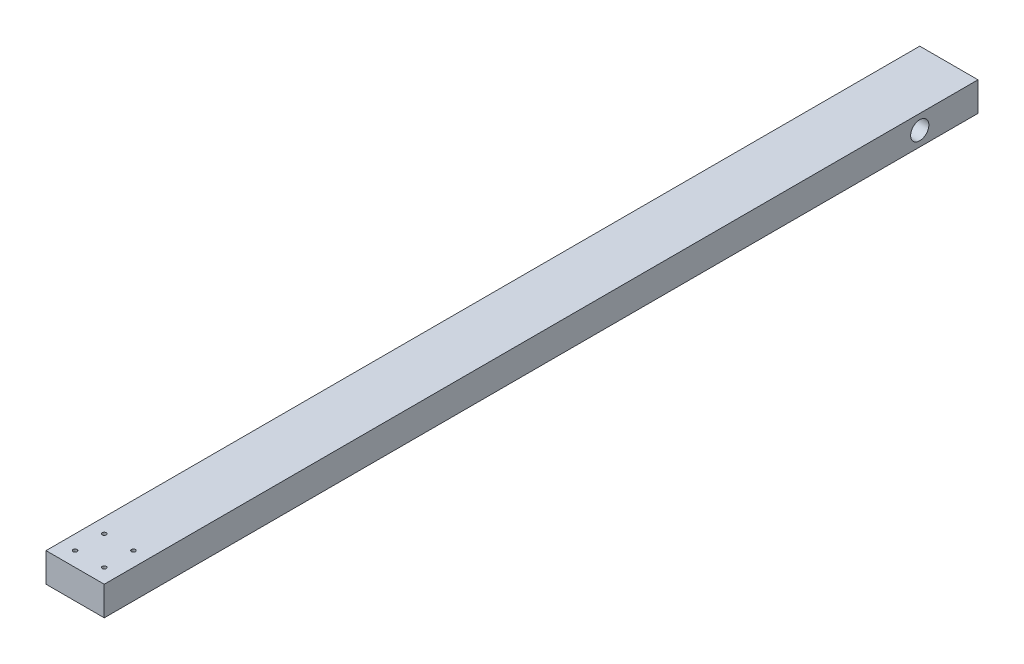
ISO-10303-21;
HEADER;
FILE_DESCRIPTION(('STEP AP214'),'2;1');
FILE_NAME('part.step','',(''),(''),'','','');
FILE_SCHEMA(('AUTOMOTIVE_DESIGN { 1 0 10303 214 1 1 1 1 }'));
ENDSEC;
DATA;
#1=APPLICATION_CONTEXT('core data for automotive mechanical design processes');
#2=APPLICATION_PROTOCOL_DEFINITION('international standard','automotive_design',2000,#1);
#3=PRODUCT_CONTEXT('',#1,'mechanical');
#4=PRODUCT('Part','Part','',(#3));
#5=PRODUCT_RELATED_PRODUCT_CATEGORY('part','',(#4));
#6=PRODUCT_DEFINITION_FORMATION('','',#4);
#7=PRODUCT_DEFINITION_CONTEXT('part definition',#1,'design');
#8=PRODUCT_DEFINITION('design','',#6,#7);
#9=PRODUCT_DEFINITION_SHAPE('','',#8);
#10=(LENGTH_UNIT() NAMED_UNIT(*) SI_UNIT(.MILLI.,.METRE.));
#11=(NAMED_UNIT(*) PLANE_ANGLE_UNIT() SI_UNIT($,.RADIAN.));
#12=(NAMED_UNIT(*) SI_UNIT($,.STERADIAN.) SOLID_ANGLE_UNIT());
#13=UNCERTAINTY_MEASURE_WITH_UNIT(LENGTH_MEASURE(1.E-05),#10,'distance_accuracy_value','');
#14=(GEOMETRIC_REPRESENTATION_CONTEXT(3) GLOBAL_UNCERTAINTY_ASSIGNED_CONTEXT((#13)) GLOBAL_UNIT_ASSIGNED_CONTEXT((#10,
#11,#12)) REPRESENTATION_CONTEXT('',''));
#15=CARTESIAN_POINT('',(0.,0.,0.));
#16=DIRECTION('',(0.,0.,1.));
#17=DIRECTION('',(1.,0.,0.));
#18=AXIS2_PLACEMENT_3D('',#15,#16,#17);
#19=CARTESIAN_POINT('',(50.8,25.4,1524.));
#20=DIRECTION('',(-1.,0.,0.));
#21=DIRECTION('',(0.,0.,1.));
#22=AXIS2_PLACEMENT_3D('',#19,#20,#21);
#23=PLANE('',#22);
#24=CARTESIAN_POINT('',(50.8,0.,101.6));
#25=DIRECTION('',(1.,0.,0.));
#26=DIRECTION('',(0.,0.,-1.));
#27=AXIS2_PLACEMENT_3D('',#24,#25,#26);
#28=CIRCLE('',#27,15.875);
#29=CARTESIAN_POINT('',(50.8,0.,85.725));
#30=VERTEX_POINT('',#29);
#31=EDGE_CURVE('E141',#30,#30,#28,.T.);
#32=ORIENTED_EDGE('',*,*,#31,.F.);
#33=EDGE_LOOP('',(#32));
#34=FACE_BOUND('',#33,.T.);
#35=DIRECTION('',(0.,1.,0.));
#36=VECTOR('',#35,1.);
#37=CARTESIAN_POINT('',(50.8,25.4,0.));
#38=LINE('',#37,#36);
#39=CARTESIAN_POINT('',(50.8,-25.4,0.));
#40=VERTEX_POINT('',#39);
#41=CARTESIAN_POINT('',(50.8,25.4,0.));
#42=VERTEX_POINT('',#41);
#43=EDGE_CURVE('E101',#40,#42,#38,.T.);
#44=ORIENTED_EDGE('',*,*,#43,.T.);
#45=DIRECTION('',(0.,0.,-1.));
#46=VECTOR('',#45,1.);
#47=CARTESIAN_POINT('',(50.8,25.4,1524.));
#48=LINE('',#47,#46);
#49=CARTESIAN_POINT('',(50.8,25.4,1524.));
#50=VERTEX_POINT('',#49);
#51=EDGE_CURVE('E11',#50,#42,#48,.T.);
#52=ORIENTED_EDGE('',*,*,#51,.F.);
#53=DIRECTION('',(0.,1.,0.));
#54=VECTOR('',#53,1.);
#55=CARTESIAN_POINT('',(50.8,25.4,1524.));
#56=LINE('',#55,#54);
#57=CARTESIAN_POINT('',(50.8,-25.4,1524.));
#58=VERTEX_POINT('',#57);
#59=EDGE_CURVE('E89',#58,#50,#56,.T.);
#60=ORIENTED_EDGE('',*,*,#59,.F.);
#61=DIRECTION('',(0.,0.,-1.));
#62=VECTOR('',#61,1.);
#63=CARTESIAN_POINT('',(50.8,-25.4,1524.));
#64=LINE('',#63,#62);
#65=EDGE_CURVE('E97',#58,#40,#64,.T.);
#66=ORIENTED_EDGE('',*,*,#65,.T.);
#67=EDGE_LOOP('',(#44,#52,#60,#66));
#68=FACE_BOUND('',#67,.T.);
#69=ADVANCED_FACE('F38',(#34,#68),#23,.F.);
#70=CARTESIAN_POINT('',(-50.8,25.4,1524.));
#71=DIRECTION('',(0.,-1.,0.));
#72=DIRECTION('',(0.,0.,-1.));
#73=AXIS2_PLACEMENT_3D('',#70,#71,#72);
#74=PLANE('',#73);
#75=CARTESIAN_POINT('',(-25.3999999999999,25.4,1447.8));
#76=DIRECTION('',(0.,1.,0.));
#77=DIRECTION('',(0.,0.,1.));
#78=AXIS2_PLACEMENT_3D('',#75,#76,#77);
#79=CIRCLE('',#78,3.49249999999999);
#80=CARTESIAN_POINT('',(-25.3999999999999,25.4,1451.2925));
#81=VERTEX_POINT('',#80);
#82=EDGE_CURVE('E124',#81,#81,#79,.T.);
#83=ORIENTED_EDGE('',*,*,#82,.F.);
#84=EDGE_LOOP('',(#83));
#85=FACE_BOUND('',#84,.T.);
#86=CARTESIAN_POINT('',(25.4000000000001,25.4,1498.6));
#87=DIRECTION('',(0.,1.,0.));
#88=DIRECTION('',(0.,0.,1.));
#89=AXIS2_PLACEMENT_3D('',#86,#87,#88);
#90=CIRCLE('',#89,3.49249999999999);
#91=CARTESIAN_POINT('',(25.4000000000001,25.4,1502.0925));
#92=VERTEX_POINT('',#91);
#93=EDGE_CURVE('E125',#92,#92,#90,.T.);
#94=ORIENTED_EDGE('',*,*,#93,.F.);
#95=EDGE_LOOP('',(#94));
#96=FACE_BOUND('',#95,.T.);
#97=CARTESIAN_POINT('',(-25.3999999999999,25.4,1498.6));
#98=DIRECTION('',(0.,1.,0.));
#99=DIRECTION('',(0.,0.,1.));
#100=AXIS2_PLACEMENT_3D('',#97,#98,#99);
#101=CIRCLE('',#100,3.49249999999999);
#102=CARTESIAN_POINT('',(-25.3999999999999,25.4,1502.0925));
#103=VERTEX_POINT('',#102);
#104=EDGE_CURVE('E135',#103,#103,#101,.T.);
#105=ORIENTED_EDGE('',*,*,#104,.F.);
#106=EDGE_LOOP('',(#105));
#107=FACE_BOUND('',#106,.T.);
#108=CARTESIAN_POINT('',(25.4000000000001,25.4,1447.8));
#109=DIRECTION('',(0.,1.,0.));
#110=DIRECTION('',(0.,0.,1.));
#111=AXIS2_PLACEMENT_3D('',#108,#109,#110);
#112=CIRCLE('',#111,3.49249999999999);
#113=CARTESIAN_POINT('',(25.4000000000001,25.4,1451.2925));
#114=VERTEX_POINT('',#113);
#115=EDGE_CURVE('E117',#114,#114,#112,.T.);
#116=ORIENTED_EDGE('',*,*,#115,.F.);
#117=EDGE_LOOP('',(#116));
#118=FACE_BOUND('',#117,.T.);
#119=DIRECTION('',(-1.,0.,0.));
#120=VECTOR('',#119,1.);
#121=CARTESIAN_POINT('',(-50.8,25.4,0.));
#122=LINE('',#121,#120);
#123=CARTESIAN_POINT('',(-50.8,25.4,0.));
#124=VERTEX_POINT('',#123);
#125=EDGE_CURVE('E93',#42,#124,#122,.T.);
#126=ORIENTED_EDGE('',*,*,#125,.T.);
#127=DIRECTION('',(0.,0.,-1.));
#128=VECTOR('',#127,1.);
#129=CARTESIAN_POINT('',(-50.8,25.4,1524.));
#130=LINE('',#129,#128);
#131=CARTESIAN_POINT('',(-50.8,25.4,1524.));
#132=VERTEX_POINT('',#131);
#133=EDGE_CURVE('E46',#132,#124,#130,.T.);
#134=ORIENTED_EDGE('',*,*,#133,.F.);
#135=DIRECTION('',(-1.,0.,0.));
#136=VECTOR('',#135,1.);
#137=CARTESIAN_POINT('',(-50.8,25.4,1524.));
#138=LINE('',#137,#136);
#139=EDGE_CURVE('E84',#50,#132,#138,.T.);
#140=ORIENTED_EDGE('',*,*,#139,.F.);
#141=ORIENTED_EDGE('',*,*,#51,.T.);
#142=EDGE_LOOP('',(#126,#134,#140,#141));
#143=FACE_BOUND('',#142,.T.);
#144=ADVANCED_FACE('F92',(#85,#96,#107,#118,#143),#74,.F.);
#145=CARTESIAN_POINT('',(-50.8,25.4,1524.));
#146=DIRECTION('',(1.,0.,0.));
#147=DIRECTION('',(0.,0.,-1.));
#148=AXIS2_PLACEMENT_3D('',#145,#146,#147);
#149=PLANE('',#148);
#150=CARTESIAN_POINT('',(-50.8,0.,101.6));
#151=DIRECTION('',(1.,0.,0.));
#152=DIRECTION('',(0.,0.,-1.));
#153=AXIS2_PLACEMENT_3D('',#150,#151,#152);
#154=CIRCLE('',#153,15.875);
#155=CARTESIAN_POINT('',(-50.8,0.,85.725));
#156=VERTEX_POINT('',#155);
#157=EDGE_CURVE('E138',#156,#156,#154,.F.);
#158=ORIENTED_EDGE('',*,*,#157,.F.);
#159=EDGE_LOOP('',(#158));
#160=FACE_BOUND('',#159,.T.);
#161=DIRECTION('',(0.,-1.,0.));
#162=VECTOR('',#161,1.);
#163=CARTESIAN_POINT('',(-50.8,25.4,0.));
#164=LINE('',#163,#162);
#165=CARTESIAN_POINT('',(-50.8,-25.4,0.));
#166=VERTEX_POINT('',#165);
#167=EDGE_CURVE('E71',#124,#166,#164,.T.);
#168=ORIENTED_EDGE('',*,*,#167,.T.);
#169=DIRECTION('',(0.,0.,-1.));
#170=VECTOR('',#169,1.);
#171=CARTESIAN_POINT('',(-50.8,-25.4,1524.));
#172=LINE('',#171,#170);
#173=CARTESIAN_POINT('',(-50.8,-25.4,1524.));
#174=VERTEX_POINT('',#173);
#175=EDGE_CURVE('E94',#174,#166,#172,.T.);
#176=ORIENTED_EDGE('',*,*,#175,.F.);
#177=DIRECTION('',(0.,-1.,0.));
#178=VECTOR('',#177,1.);
#179=CARTESIAN_POINT('',(-50.8,25.4,1524.));
#180=LINE('',#179,#178);
#181=EDGE_CURVE('E87',#132,#174,#180,.T.);
#182=ORIENTED_EDGE('',*,*,#181,.F.);
#183=ORIENTED_EDGE('',*,*,#133,.T.);
#184=EDGE_LOOP('',(#168,#176,#182,#183));
#185=FACE_BOUND('',#184,.T.);
#186=ADVANCED_FACE('F95',(#160,#185),#149,.F.);
#187=CARTESIAN_POINT('',(-50.8,-25.4,1524.));
#188=DIRECTION('',(0.,1.,0.));
#189=DIRECTION('',(0.,0.,1.));
#190=AXIS2_PLACEMENT_3D('',#187,#188,#189);
#191=PLANE('',#190);
#192=CARTESIAN_POINT('',(-25.3999999999999,-25.4,1447.8));
#193=DIRECTION('',(0.,1.,0.));
#194=DIRECTION('',(0.,0.,1.));
#195=AXIS2_PLACEMENT_3D('',#192,#193,#194);
#196=CIRCLE('',#195,3.49249999999999);
#197=CARTESIAN_POINT('',(-25.3999999999999,-25.4,1451.2925));
#198=VERTEX_POINT('',#197);
#199=EDGE_CURVE('E120',#198,#198,#196,.F.);
#200=ORIENTED_EDGE('',*,*,#199,.F.);
#201=EDGE_LOOP('',(#200));
#202=FACE_BOUND('',#201,.T.);
#203=CARTESIAN_POINT('',(25.4000000000001,-25.4,1498.6));
#204=DIRECTION('',(0.,1.,0.));
#205=DIRECTION('',(0.,0.,1.));
#206=AXIS2_PLACEMENT_3D('',#203,#204,#205);
#207=CIRCLE('',#206,3.49249999999999);
#208=CARTESIAN_POINT('',(25.4000000000001,-25.4,1502.0925));
#209=VERTEX_POINT('',#208);
#210=EDGE_CURVE('E121',#209,#209,#207,.F.);
#211=ORIENTED_EDGE('',*,*,#210,.F.);
#212=EDGE_LOOP('',(#211));
#213=FACE_BOUND('',#212,.T.);
#214=CARTESIAN_POINT('',(-25.3999999999999,-25.4,1498.6));
#215=DIRECTION('',(0.,1.,0.));
#216=DIRECTION('',(0.,0.,1.));
#217=AXIS2_PLACEMENT_3D('',#214,#215,#216);
#218=CIRCLE('',#217,3.49249999999999);
#219=CARTESIAN_POINT('',(-25.3999999999999,-25.4,1502.0925));
#220=VERTEX_POINT('',#219);
#221=EDGE_CURVE('E128',#220,#220,#218,.F.);
#222=ORIENTED_EDGE('',*,*,#221,.F.);
#223=EDGE_LOOP('',(#222));
#224=FACE_BOUND('',#223,.T.);
#225=CARTESIAN_POINT('',(25.4000000000001,-25.4,1447.8));
#226=DIRECTION('',(0.,1.,0.));
#227=DIRECTION('',(0.,0.,1.));
#228=AXIS2_PLACEMENT_3D('',#225,#226,#227);
#229=CIRCLE('',#228,3.49249999999999);
#230=CARTESIAN_POINT('',(25.4000000000001,-25.4,1451.2925));
#231=VERTEX_POINT('',#230);
#232=EDGE_CURVE('E104',#231,#231,#229,.F.);
#233=ORIENTED_EDGE('',*,*,#232,.F.);
#234=EDGE_LOOP('',(#233));
#235=FACE_BOUND('',#234,.T.);
#236=DIRECTION('',(1.,0.,0.));
#237=VECTOR('',#236,1.);
#238=CARTESIAN_POINT('',(-50.8,-25.4,0.));
#239=LINE('',#238,#237);
#240=EDGE_CURVE('E77',#166,#40,#239,.T.);
#241=ORIENTED_EDGE('',*,*,#240,.T.);
#242=ORIENTED_EDGE('',*,*,#65,.F.);
#243=DIRECTION('',(1.,0.,0.));
#244=VECTOR('',#243,1.);
#245=CARTESIAN_POINT('',(-50.8,-25.4,1524.));
#246=LINE('',#245,#244);
#247=EDGE_CURVE('E54',#174,#58,#246,.T.);
#248=ORIENTED_EDGE('',*,*,#247,.F.);
#249=ORIENTED_EDGE('',*,*,#175,.T.);
#250=EDGE_LOOP('',(#241,#242,#248,#249));
#251=FACE_BOUND('',#250,.T.);
#252=ADVANCED_FACE('F109',(#202,#213,#224,#235,#251),#191,.F.);
#253=CARTESIAN_POINT('',(0.,0.,1524.));
#254=DIRECTION('',(0.,0.,1.));
#255=DIRECTION('',(1.,0.,0.));
#256=AXIS2_PLACEMENT_3D('',#253,#254,#255);
#257=PLANE('',#256);
#258=ORIENTED_EDGE('',*,*,#59,.T.);
#259=ORIENTED_EDGE('',*,*,#139,.T.);
#260=ORIENTED_EDGE('',*,*,#181,.T.);
#261=ORIENTED_EDGE('',*,*,#247,.T.);
#262=EDGE_LOOP('',(#258,#259,#260,#261));
#263=FACE_BOUND('',#262,.T.);
#264=ADVANCED_FACE('F85',(#263),#257,.T.);
#265=CARTESIAN_POINT('',(0.,0.,0.));
#266=DIRECTION('',(0.,0.,1.));
#267=DIRECTION('',(1.,0.,0.));
#268=AXIS2_PLACEMENT_3D('',#265,#266,#267);
#269=PLANE('',#268);
#270=ORIENTED_EDGE('',*,*,#43,.F.);
#271=ORIENTED_EDGE('',*,*,#240,.F.);
#272=ORIENTED_EDGE('',*,*,#167,.F.);
#273=ORIENTED_EDGE('',*,*,#125,.F.);
#274=EDGE_LOOP('',(#270,#271,#272,#273));
#275=FACE_BOUND('',#274,.T.);
#276=ADVANCED_FACE('F112',(#275),#269,.F.);
#277=CARTESIAN_POINT('',(25.4000000000001,-35.2782817331759,1447.8));
#278=DIRECTION('',(0.,1.,0.));
#279=DIRECTION('',(0.,0.,1.));
#280=AXIS2_PLACEMENT_3D('',#277,#278,#279);
#281=CYLINDRICAL_SURFACE('',#280,3.49249999999999);
#282=ORIENTED_EDGE('',*,*,#232,.T.);
#283=EDGE_LOOP('',(#282));
#284=FACE_BOUND('',#283,.T.);
#285=ORIENTED_EDGE('',*,*,#115,.T.);
#286=EDGE_LOOP('',(#285));
#287=FACE_BOUND('',#286,.T.);
#288=ADVANCED_FACE('F165',(#284,#287),#281,.F.);
#289=CARTESIAN_POINT('',(-25.3999999999999,-35.2782817331759,1498.6));
#290=DIRECTION('',(0.,1.,0.));
#291=DIRECTION('',(0.,0.,1.));
#292=AXIS2_PLACEMENT_3D('',#289,#290,#291);
#293=CYLINDRICAL_SURFACE('',#292,3.49249999999999);
#294=ORIENTED_EDGE('',*,*,#221,.T.);
#295=EDGE_LOOP('',(#294));
#296=FACE_BOUND('',#295,.T.);
#297=ORIENTED_EDGE('',*,*,#104,.T.);
#298=EDGE_LOOP('',(#297));
#299=FACE_BOUND('',#298,.T.);
#300=ADVANCED_FACE('F170',(#296,#299),#293,.F.);
#301=CARTESIAN_POINT('',(25.4000000000001,-35.2782817331759,1498.6));
#302=DIRECTION('',(0.,1.,0.));
#303=DIRECTION('',(0.,0.,1.));
#304=AXIS2_PLACEMENT_3D('',#301,#302,#303);
#305=CYLINDRICAL_SURFACE('',#304,3.49249999999999);
#306=ORIENTED_EDGE('',*,*,#210,.T.);
#307=EDGE_LOOP('',(#306));
#308=FACE_BOUND('',#307,.T.);
#309=ORIENTED_EDGE('',*,*,#93,.T.);
#310=EDGE_LOOP('',(#309));
#311=FACE_BOUND('',#310,.T.);
#312=ADVANCED_FACE('F172',(#308,#311),#305,.F.);
#313=CARTESIAN_POINT('',(-25.3999999999999,-35.2782817331759,1447.8));
#314=DIRECTION('',(0.,1.,0.));
#315=DIRECTION('',(0.,0.,1.));
#316=AXIS2_PLACEMENT_3D('',#313,#314,#315);
#317=CYLINDRICAL_SURFACE('',#316,3.49249999999999);
#318=ORIENTED_EDGE('',*,*,#199,.T.);
#319=EDGE_LOOP('',(#318));
#320=FACE_BOUND('',#319,.T.);
#321=ORIENTED_EDGE('',*,*,#82,.T.);
#322=EDGE_LOOP('',(#321));
#323=FACE_BOUND('',#322,.T.);
#324=ADVANCED_FACE('F175',(#320,#323),#317,.F.);
#325=CARTESIAN_POINT('',(-95.7012806053458,0.,101.6));
#326=DIRECTION('',(1.,0.,0.));
#327=DIRECTION('',(0.,0.,-1.));
#328=AXIS2_PLACEMENT_3D('',#325,#326,#327);
#329=CYLINDRICAL_SURFACE('',#328,15.875);
#330=CARTESIAN_POINT('',(-50.8,0.,85.725));
#331=CARTESIAN_POINT('',(-49.7416666666667,0.,85.725));
#332=CARTESIAN_POINT('',(-48.6833333333333,0.,85.725));
#333=CARTESIAN_POINT('',(-46.5666666666667,0.,85.725));
#334=CARTESIAN_POINT('',(-45.5083333333333,0.,85.725));
#335=CARTESIAN_POINT('',(-43.3916666666667,0.,85.725));
#336=CARTESIAN_POINT('',(-42.3333333333333,0.,85.725));
#337=CARTESIAN_POINT('',(-40.2166666666667,0.,85.725));
#338=CARTESIAN_POINT('',(-39.1583333333333,0.,85.725));
#339=CARTESIAN_POINT('',(-37.0416666666667,0.,85.725));
#340=CARTESIAN_POINT('',(-35.9833333333333,0.,85.725));
#341=CARTESIAN_POINT('',(-33.8666666666667,0.,85.725));
#342=CARTESIAN_POINT('',(-32.8083333333333,0.,85.725));
#343=CARTESIAN_POINT('',(-30.6916666666667,0.,85.725));
#344=CARTESIAN_POINT('',(-29.6333333333333,0.,85.725));
#345=CARTESIAN_POINT('',(-27.5166666666667,0.,85.725));
#346=CARTESIAN_POINT('',(-26.4583333333333,0.,85.725));
#347=CARTESIAN_POINT('',(-24.3416666666667,0.,85.725));
#348=CARTESIAN_POINT('',(-23.2833333333333,0.,85.725));
#349=CARTESIAN_POINT('',(-21.1666666666667,0.,85.725));
#350=CARTESIAN_POINT('',(-20.1083333333333,0.,85.725));
#351=CARTESIAN_POINT('',(-17.9916666666667,0.,85.725));
#352=CARTESIAN_POINT('',(-16.9333333333333,0.,85.725));
#353=CARTESIAN_POINT('',(-14.8166666666667,0.,85.725));
#354=CARTESIAN_POINT('',(-13.7583333333333,0.,85.725));
#355=CARTESIAN_POINT('',(-11.6416666666667,0.,85.725));
#356=CARTESIAN_POINT('',(-10.5833333333333,0.,85.725));
#357=CARTESIAN_POINT('',(-8.46666666666667,0.,85.725));
#358=CARTESIAN_POINT('',(-7.40833333333333,0.,85.725));
#359=CARTESIAN_POINT('',(-5.29166666666666,0.,85.725));
#360=CARTESIAN_POINT('',(-4.23333333333333,0.,85.725));
#361=CARTESIAN_POINT('',(-2.11666666666666,0.,85.725));
#362=CARTESIAN_POINT('',(-1.05833333333333,0.,85.725));
#363=CARTESIAN_POINT('',(1.05833333333333,0.,85.725));
#364=CARTESIAN_POINT('',(2.11666666666666,0.,85.725));
#365=CARTESIAN_POINT('',(4.23333333333333,0.,85.725));
#366=CARTESIAN_POINT('',(5.29166666666666,0.,85.725));
#367=CARTESIAN_POINT('',(7.40833333333333,0.,85.725));
#368=CARTESIAN_POINT('',(8.46666666666667,0.,85.725));
#369=CARTESIAN_POINT('',(10.5833333333333,0.,85.725));
#370=CARTESIAN_POINT('',(11.6416666666667,0.,85.725));
#371=CARTESIAN_POINT('',(13.7583333333333,0.,85.725));
#372=CARTESIAN_POINT('',(14.8166666666667,0.,85.725));
#373=CARTESIAN_POINT('',(16.9333333333333,0.,85.725));
#374=CARTESIAN_POINT('',(17.9916666666667,0.,85.725));
#375=CARTESIAN_POINT('',(20.1083333333333,0.,85.725));
#376=CARTESIAN_POINT('',(21.1666666666667,0.,85.725));
#377=CARTESIAN_POINT('',(23.2833333333333,0.,85.725));
#378=CARTESIAN_POINT('',(24.3416666666667,0.,85.725));
#379=CARTESIAN_POINT('',(26.4583333333333,0.,85.725));
#380=CARTESIAN_POINT('',(27.5166666666667,0.,85.725));
#381=CARTESIAN_POINT('',(29.6333333333333,0.,85.725));
#382=CARTESIAN_POINT('',(30.6916666666667,0.,85.725));
#383=CARTESIAN_POINT('',(32.8083333333333,0.,85.725));
#384=CARTESIAN_POINT('',(33.8666666666667,0.,85.725));
#385=CARTESIAN_POINT('',(35.9833333333333,0.,85.725));
#386=CARTESIAN_POINT('',(37.0416666666667,0.,85.725));
#387=CARTESIAN_POINT('',(39.1583333333333,0.,85.725));
#388=CARTESIAN_POINT('',(40.2166666666667,0.,85.725));
#389=CARTESIAN_POINT('',(42.3333333333333,0.,85.725));
#390=CARTESIAN_POINT('',(43.3916666666667,0.,85.725));
#391=CARTESIAN_POINT('',(45.5083333333333,0.,85.725));
#392=CARTESIAN_POINT('',(46.5666666666667,0.,85.725));
#393=CARTESIAN_POINT('',(48.6833333333333,0.,85.725));
#394=CARTESIAN_POINT('',(49.7416666666667,0.,85.725));
#395=CARTESIAN_POINT('',(50.8,0.,85.725));
#396=B_SPLINE_CURVE_WITH_KNOTS('',3,(#330,#331,#332,#333,#334,#335,#336,#337,#338,#339,#340,
#341,#342,#343,#344,#345,#346,#347,#348,#349,#350,#351,#352,#353,#354,#355,#356,#357,#358,#359,
#360,#361,#362,#363,#364,#365,#366,#367,#368,#369,#370,#371,#372,#373,#374,#375,#376,#377,#378,
#379,#380,#381,#382,#383,#384,#385,#386,#387,#388,#389,#390,#391,#392,#393,#394,#395),
.UNSPECIFIED.,.F.,.F.,(4,2,2,2,2,2,2,2,2,2,2,2,2,2,2,2,2,2,2,2,2,2,2,2,2,2,2,2,2,2,2,2,4),(0.,
3.175,6.35,9.52500000000001,12.7,15.875,19.05,22.225,25.4,28.575,31.75,34.925,38.1,41.275,44.45,
47.625,50.8,53.975,57.15,60.325,63.5,66.675,69.85,73.025,76.2,79.375,82.55,85.725,88.9,92.075,
95.25,98.425,101.6),.UNSPECIFIED.);
#397=EDGE_CURVE('BSEAM145',#156,#30,#396,.T.);
#398=ORIENTED_EDGE('',*,*,#157,.T.);
#399=ORIENTED_EDGE('',*,*,#31,.T.);
#400=ORIENTED_EDGE('',*,*,#397,.T.);
#401=ORIENTED_EDGE('',*,*,#397,.F.);
#402=EDGE_LOOP('',(#398,#400,#399,#401));
#403=FACE_BOUND('',#402,.T.);
#404=ADVANCED_FACE('F145',(#403),#329,.F.);
#405=CLOSED_SHELL('',(#69,#144,#186,#252,#264,#276,#288,#300,#312,#324,#404));
#406=MANIFOLD_SOLID_BREP('B2',#405);
#407=ADVANCED_BREP_SHAPE_REPRESENTATION('',(#18,#406),#14);
#408=SHAPE_DEFINITION_REPRESENTATION(#9,#407);
ENDSEC;
END-ISO-10303-21;
